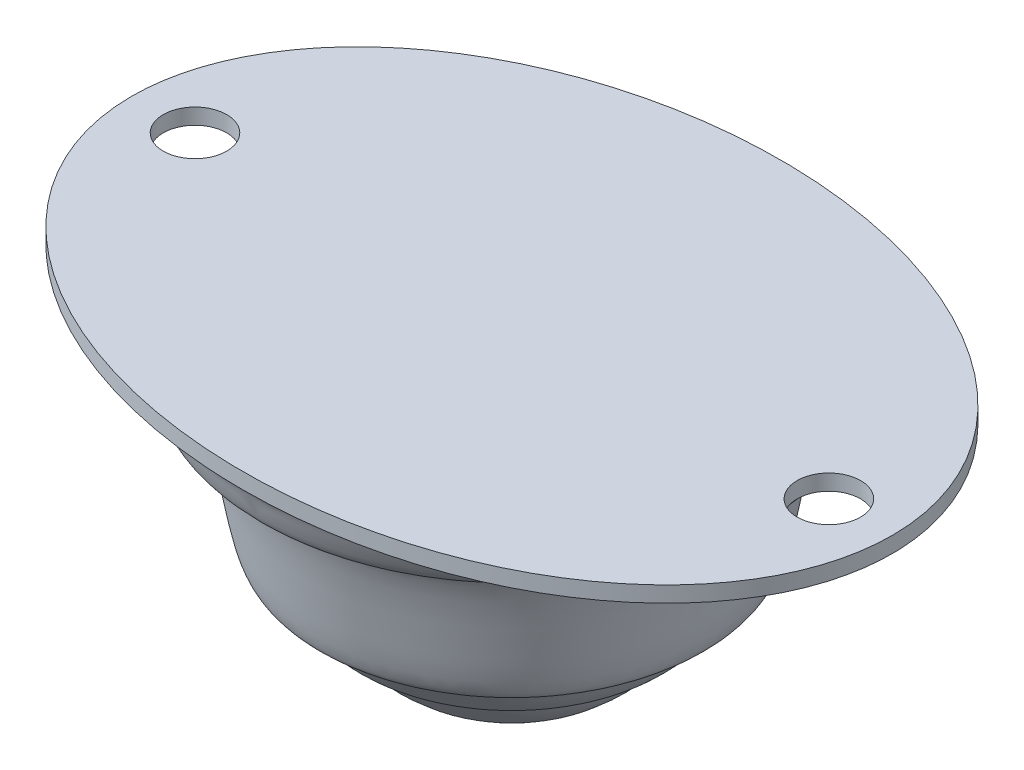
ISO-10303-21;
HEADER;
FILE_DESCRIPTION(('STEP AP214'),'2;1');
FILE_NAME('part.step','',(''),(''),'','','');
FILE_SCHEMA(('AUTOMOTIVE_DESIGN { 1 0 10303 214 1 1 1 1 }'));
ENDSEC;
DATA;
#1=APPLICATION_CONTEXT('core data for automotive mechanical design processes');
#2=APPLICATION_PROTOCOL_DEFINITION('international standard','automotive_design',2000,#1);
#3=PRODUCT_CONTEXT('',#1,'mechanical');
#4=PRODUCT('Part','Part','',(#3));
#5=PRODUCT_RELATED_PRODUCT_CATEGORY('part','',(#4));
#6=PRODUCT_DEFINITION_FORMATION('','',#4);
#7=PRODUCT_DEFINITION_CONTEXT('part definition',#1,'design');
#8=PRODUCT_DEFINITION('design','',#6,#7);
#9=PRODUCT_DEFINITION_SHAPE('','',#8);
#10=(LENGTH_UNIT() NAMED_UNIT(*) SI_UNIT(.MILLI.,.METRE.));
#11=(NAMED_UNIT(*) PLANE_ANGLE_UNIT() SI_UNIT($,.RADIAN.));
#12=(NAMED_UNIT(*) SI_UNIT($,.STERADIAN.) SOLID_ANGLE_UNIT());
#13=UNCERTAINTY_MEASURE_WITH_UNIT(LENGTH_MEASURE(1.E-05),#10,'distance_accuracy_value','');
#14=(GEOMETRIC_REPRESENTATION_CONTEXT(3) GLOBAL_UNCERTAINTY_ASSIGNED_CONTEXT((#13)) GLOBAL_UNIT_ASSIGNED_CONTEXT((#10,
#11,#12)) REPRESENTATION_CONTEXT('',''));
#15=CARTESIAN_POINT('',(0.,0.,0.));
#16=DIRECTION('',(0.,0.,1.));
#17=DIRECTION('',(1.,0.,0.));
#18=AXIS2_PLACEMENT_3D('',#15,#16,#17);
#19=CARTESIAN_POINT('',(8.78212895598564,-13.8809778374717,0.));
#20=CARTESIAN_POINT('',(9.2438371267902,-11.3265941937783,0.));
#21=CARTESIAN_POINT('',(8.54971954360399,-15.1109730836281,0.));
#22=CARTESIAN_POINT('',(10.4223688839954,-12.6929738457824,0.));
#23=CARTESIAN_POINT('',(11.3650867281199,-11.2439184889037,0.));
#24=CARTESIAN_POINT('',(12.7657246668574,-12.1459563186942,0.));
#25=CARTESIAN_POINT('',(13.3178960844036,-2.27360381044947,0.));
#26=CARTESIAN_POINT('',(16.2214381169299,-3.07696594554119,0.));
#27=CARTESIAN_POINT('',(16.4988498326786,-0.232288976103883,0.));
#28=CARTESIAN_POINT('',(17.,0.,0.));
#29=B_SPLINE_CURVE_WITH_KNOTS('',3,(#19,#20,#21,#22,#23,#24,#25,#26,#27,#28),.UNSPECIFIED.,.F.,
.F.,(4,1,1,1,1,1,1,4),(0.,0.0790584028704653,0.126144720028259,0.205259264550949,
0.292388848818464,0.631135886890785,0.764879746973543,1.),.UNSPECIFIED.);
#30=CARTESIAN_POINT('',(0.,0.,0.));
#31=DIRECTION('',(0.,1.,0.));
#32=AXIS1_PLACEMENT('',#30,#31);
#33=SURFACE_OF_REVOLUTION('',#29,#32);
#34=CARTESIAN_POINT('',(0.,0.,0.));
#35=DIRECTION('',(0.,1.,0.));
#36=DIRECTION('',(-1.,0.,0.));
#37=AXIS2_PLACEMENT_3D('',#34,#35,#36);
#38=CIRCLE('',#37,17.);
#39=CARTESIAN_POINT('',(0.,0.,17.));
#40=VERTEX_POINT('',#39);
#41=CARTESIAN_POINT('',(0.,0.,-17.));
#42=VERTEX_POINT('',#41);
#43=EDGE_CURVE('E41',#40,#42,#38,.T.);
#44=ORIENTED_EDGE('',*,*,#43,.F.);
#45=EDGE_CURVE('E48',#42,#40,#38,.T.);
#46=ORIENTED_EDGE('',*,*,#45,.F.);
#47=EDGE_LOOP('',(#44,#46));
#48=FACE_BOUND('',#47,.T.);
#49=CARTESIAN_POINT('',(0.,-13.8809778374717,0.));
#50=DIRECTION('',(0.,1.,0.));
#51=DIRECTION('',(-1.,0.,0.));
#52=AXIS2_PLACEMENT_3D('',#49,#50,#51);
#53=CIRCLE('',#52,8.78212895598564);
#54=CARTESIAN_POINT('',(-8.78212895598564,-13.8809778374717,0.));
#55=VERTEX_POINT('',#54);
#56=EDGE_CURVE('E11',#55,#55,#53,.T.);
#57=ORIENTED_EDGE('',*,*,#56,.T.);
#58=EDGE_LOOP('',(#57));
#59=FACE_BOUND('',#58,.T.);
#60=ADVANCED_FACE('F33',(#48,#59),#33,.T.);
#61=CARTESIAN_POINT('',(0.,-8.90723485664861,0.));
#62=DIRECTION('',(0.,1.,0.));
#63=DIRECTION('',(1.,0.,0.));
#64=AXIS2_PLACEMENT_3D('',#61,#62,#63);
#65=SPHERICAL_SURFACE('',#64,10.0927651433514);
#66=ORIENTED_EDGE('',*,*,#56,.F.);
#67=EDGE_LOOP('',(#66));
#68=FACE_BOUND('',#67,.T.);
#69=ADVANCED_FACE('F84',(#68),#65,.T.);
#70=CARTESIAN_POINT('',(0.,0.,0.));
#71=DIRECTION('',(0.,1.,0.));
#72=DIRECTION('',(-1.,0.,0.));
#73=AXIS2_PLACEMENT_3D('',#70,#71,#72);
#74=PLANE('',#73);
#75=CARTESIAN_POINT('',(-20.,0.,0.));
#76=DIRECTION('',(0.,1.,0.));
#77=DIRECTION('',(-1.,0.,0.));
#78=AXIS2_PLACEMENT_3D('',#75,#76,#77);
#79=CIRCLE('',#78,2.);
#80=CARTESIAN_POINT('',(-22.,0.,0.));
#81=VERTEX_POINT('',#80);
#82=EDGE_CURVE('E76',#81,#81,#79,.T.);
#83=ORIENTED_EDGE('',*,*,#82,.T.);
#84=EDGE_LOOP('',(#83));
#85=FACE_BOUND('',#84,.T.);
#86=CARTESIAN_POINT('',(0.,0.,0.));
#87=DIRECTION('',(0.,1.,0.));
#88=DIRECTION('',(-1.,0.,0.));
#89=AXIS2_PLACEMENT_3D('',#86,#87,#88);
#90=ELLIPSE('',#89,23.9999999999998,17.);
#91=EDGE_CURVE('E60',#42,#40,#90,.T.);
#92=ORIENTED_EDGE('',*,*,#91,.F.);
#93=ORIENTED_EDGE('',*,*,#45,.T.);
#94=EDGE_LOOP('',(#92,#93));
#95=FACE_BOUND('',#94,.T.);
#96=ADVANCED_FACE('F61',(#85,#95),#74,.F.);
#97=CARTESIAN_POINT('',(0.,1.,0.));
#98=DIRECTION('',(0.,1.,0.));
#99=DIRECTION('',(-1.,0.,0.));
#100=AXIS2_PLACEMENT_3D('',#97,#98,#99);
#101=PLANE('',#100);
#102=CARTESIAN_POINT('',(-20.,0.999999999999998,0.));
#103=DIRECTION('',(0.,1.,0.));
#104=DIRECTION('',(-1.,0.,0.));
#105=AXIS2_PLACEMENT_3D('',#102,#103,#104);
#106=CIRCLE('',#105,2.);
#107=CARTESIAN_POINT('',(-22.,0.999999999999997,0.));
#108=VERTEX_POINT('',#107);
#109=EDGE_CURVE('E63',#108,#108,#106,.T.);
#110=ORIENTED_EDGE('',*,*,#109,.F.);
#111=EDGE_LOOP('',(#110));
#112=FACE_BOUND('',#111,.T.);
#113=CARTESIAN_POINT('',(0.,1.,0.));
#114=DIRECTION('',(0.,1.,0.));
#115=DIRECTION('',(-1.,0.,0.));
#116=AXIS2_PLACEMENT_3D('',#113,#114,#115);
#117=ELLIPSE('',#116,23.9999999999998,17.);
#118=CARTESIAN_POINT('',(-23.9999999999998,0.999999999999997,0.));
#119=VERTEX_POINT('',#118);
#120=EDGE_CURVE('E53',#119,#119,#117,.T.);
#121=ORIENTED_EDGE('',*,*,#120,.T.);
#122=EDGE_LOOP('',(#121));
#123=FACE_BOUND('',#122,.T.);
#124=CARTESIAN_POINT('',(20.,1.,0.));
#125=DIRECTION('',(0.,1.,0.));
#126=DIRECTION('',(-1.,0.,0.));
#127=AXIS2_PLACEMENT_3D('',#124,#125,#126);
#128=CIRCLE('',#127,2.);
#129=CARTESIAN_POINT('',(18.,1.,0.));
#130=VERTEX_POINT('',#129);
#131=EDGE_CURVE('E151',#130,#130,#128,.T.);
#132=ORIENTED_EDGE('',*,*,#131,.F.);
#133=EDGE_LOOP('',(#132));
#134=FACE_BOUND('',#133,.T.);
#135=ADVANCED_FACE('F91',(#112,#123,#134),#101,.T.);
#136=EDGE_CURVE('E59',#40,#42,#90,.T.);
#137=ORIENTED_EDGE('',*,*,#136,.F.);
#138=ORIENTED_EDGE('',*,*,#43,.T.);
#139=EDGE_LOOP('',(#137,#138));
#140=FACE_BOUND('',#139,.T.);
#141=CARTESIAN_POINT('',(20.,0.,0.));
#142=DIRECTION('',(0.,1.,0.));
#143=DIRECTION('',(-1.,0.,0.));
#144=AXIS2_PLACEMENT_3D('',#141,#142,#143);
#145=CIRCLE('',#144,2.);
#146=CARTESIAN_POINT('',(18.,0.,0.));
#147=VERTEX_POINT('',#146);
#148=EDGE_CURVE('E154',#147,#147,#145,.T.);
#149=ORIENTED_EDGE('',*,*,#148,.T.);
#150=EDGE_LOOP('',(#149));
#151=FACE_BOUND('',#150,.T.);
#152=ADVANCED_FACE('F56',(#140,#151),#74,.F.);
#153=DIRECTION('',(0.,-1.,0.));
#154=VECTOR('',#153,1.);
#155=SURFACE_OF_LINEAR_EXTRUSION('',#117,#154);
#156=ORIENTED_EDGE('',*,*,#120,.F.);
#157=EDGE_LOOP('',(#156));
#158=FACE_BOUND('',#157,.T.);
#159=ORIENTED_EDGE('',*,*,#136,.T.);
#160=ORIENTED_EDGE('',*,*,#91,.T.);
#161=EDGE_LOOP('',(#159,#160));
#162=FACE_BOUND('',#161,.T.);
#163=ADVANCED_FACE('F65',(#158,#162),#155,.F.);
#164=CARTESIAN_POINT('',(-20.,0.999999999999998,0.));
#165=DIRECTION('',(0.,-1.,0.));
#166=DIRECTION('',(1.,0.,0.));
#167=AXIS2_PLACEMENT_3D('',#164,#165,#166);
#168=CYLINDRICAL_SURFACE('',#167,2.);
#169=ORIENTED_EDGE('',*,*,#109,.T.);
#170=EDGE_LOOP('',(#169));
#171=FACE_BOUND('',#170,.T.);
#172=ORIENTED_EDGE('',*,*,#82,.F.);
#173=EDGE_LOOP('',(#172));
#174=FACE_BOUND('',#173,.T.);
#175=ADVANCED_FACE('F81',(#171,#174),#168,.F.);
#176=CARTESIAN_POINT('',(20.,1.,0.));
#177=DIRECTION('',(0.,-1.,0.));
#178=DIRECTION('',(1.,0.,0.));
#179=AXIS2_PLACEMENT_3D('',#176,#177,#178);
#180=CYLINDRICAL_SURFACE('',#179,2.);
#181=ORIENTED_EDGE('',*,*,#131,.T.);
#182=EDGE_LOOP('',(#181));
#183=FACE_BOUND('',#182,.T.);
#184=ORIENTED_EDGE('',*,*,#148,.F.);
#185=EDGE_LOOP('',(#184));
#186=FACE_BOUND('',#185,.T.);
#187=ADVANCED_FACE('F134',(#183,#186),#180,.F.);
#188=CLOSED_SHELL('',(#60,#69,#96,#135,#152,#163,#175,#187));
#189=MANIFOLD_SOLID_BREP('B2',#188);
#190=ADVANCED_BREP_SHAPE_REPRESENTATION('',(#18,#189),#14);
#191=SHAPE_DEFINITION_REPRESENTATION(#9,#190);
ENDSEC;
END-ISO-10303-21;
